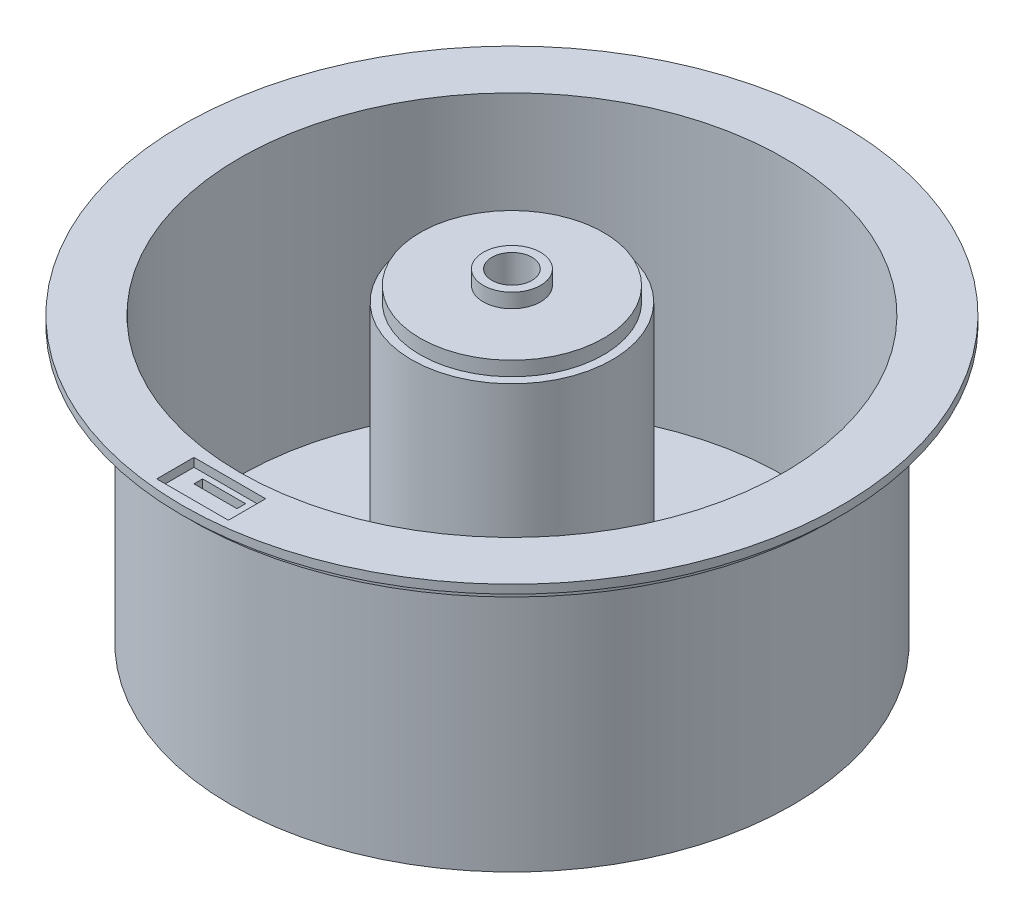
ISO-10303-21;
HEADER;
FILE_DESCRIPTION(('STEP AP214'),'2;1');
FILE_NAME('part.step','',(''),(''),'','','');
FILE_SCHEMA(('AUTOMOTIVE_DESIGN { 1 0 10303 214 1 1 1 1 }'));
ENDSEC;
DATA;
#1=APPLICATION_CONTEXT('core data for automotive mechanical design processes');
#2=APPLICATION_PROTOCOL_DEFINITION('international standard','automotive_design',2000,#1);
#3=PRODUCT_CONTEXT('',#1,'mechanical');
#4=PRODUCT('Part','Part','',(#3));
#5=PRODUCT_RELATED_PRODUCT_CATEGORY('part','',(#4));
#6=PRODUCT_DEFINITION_FORMATION('','',#4);
#7=PRODUCT_DEFINITION_CONTEXT('part definition',#1,'design');
#8=PRODUCT_DEFINITION('design','',#6,#7);
#9=PRODUCT_DEFINITION_SHAPE('','',#8);
#10=(LENGTH_UNIT() NAMED_UNIT(*) SI_UNIT(.MILLI.,.METRE.));
#11=(NAMED_UNIT(*) PLANE_ANGLE_UNIT() SI_UNIT($,.RADIAN.));
#12=(NAMED_UNIT(*) SI_UNIT($,.STERADIAN.) SOLID_ANGLE_UNIT());
#13=UNCERTAINTY_MEASURE_WITH_UNIT(LENGTH_MEASURE(1.E-05),#10,'distance_accuracy_value','');
#14=(GEOMETRIC_REPRESENTATION_CONTEXT(3) GLOBAL_UNCERTAINTY_ASSIGNED_CONTEXT((#13)) GLOBAL_UNIT_ASSIGNED_CONTEXT((#10,
#11,#12)) REPRESENTATION_CONTEXT('',''));
#15=CARTESIAN_POINT('',(0.,0.,0.));
#16=DIRECTION('',(0.,0.,1.));
#17=DIRECTION('',(1.,0.,0.));
#18=AXIS2_PLACEMENT_3D('',#15,#16,#17);
#19=CARTESIAN_POINT('',(0.,3.,0.));
#20=DIRECTION('',(0.,-1.,0.));
#21=DIRECTION('',(0.,0.,-1.));
#22=AXIS2_PLACEMENT_3D('',#19,#20,#21);
#23=CYLINDRICAL_SURFACE('',#22,115.);
#24=CARTESIAN_POINT('',(0.,3.,0.));
#25=DIRECTION('',(0.,1.,0.));
#26=DIRECTION('',(0.,0.,1.));
#27=AXIS2_PLACEMENT_3D('',#24,#25,#26);
#28=CIRCLE('',#27,115.);
#29=CARTESIAN_POINT('',(0.,3.,115.));
#30=VERTEX_POINT('',#29);
#31=EDGE_CURVE('E236',#30,#30,#28,.T.);
#32=ORIENTED_EDGE('',*,*,#31,.F.);
#33=EDGE_LOOP('',(#32));
#34=FACE_BOUND('',#33,.T.);
#35=CARTESIAN_POINT('',(0.,0.,0.));
#36=DIRECTION('',(0.,1.,0.));
#37=DIRECTION('',(0.,0.,1.));
#38=AXIS2_PLACEMENT_3D('',#35,#36,#37);
#39=CIRCLE('',#38,115.);
#40=CARTESIAN_POINT('',(0.,0.,115.));
#41=VERTEX_POINT('',#40);
#42=EDGE_CURVE('E231',#41,#41,#39,.T.);
#43=ORIENTED_EDGE('',*,*,#42,.T.);
#44=EDGE_LOOP('',(#43));
#45=FACE_BOUND('',#44,.T.);
#46=ADVANCED_FACE('F37',(#34,#45),#23,.T.);
#47=CARTESIAN_POINT('',(0.,3.,0.));
#48=DIRECTION('',(0.,1.,0.));
#49=DIRECTION('',(0.,0.,1.));
#50=AXIS2_PLACEMENT_3D('',#47,#48,#49);
#51=PLANE('',#50);
#52=DIRECTION('',(0.,0.,-1.));
#53=VECTOR('',#52,1.);
#54=CARTESIAN_POINT('',(12.5,3.,0.));
#55=LINE('',#54,#53);
#56=CARTESIAN_POINT('',(12.5,3.,111.450332640408));
#57=VERTEX_POINT('',#56);
#58=CARTESIAN_POINT('',(12.5,3.,98.4503326404081));
#59=VERTEX_POINT('',#58);
#60=EDGE_CURVE('E177',#57,#59,#55,.T.);
#61=ORIENTED_EDGE('',*,*,#60,.F.);
#62=DIRECTION('',(1.,0.,0.));
#63=VECTOR('',#62,1.);
#64=CARTESIAN_POINT('',(0.,3.,111.450332640408));
#65=LINE('',#64,#63);
#66=CARTESIAN_POINT('',(-12.5,3.,111.450332640408));
#67=VERTEX_POINT('',#66);
#68=EDGE_CURVE('E175',#67,#57,#65,.T.);
#69=ORIENTED_EDGE('',*,*,#68,.F.);
#70=DIRECTION('',(0.,0.,1.));
#71=VECTOR('',#70,1.);
#72=CARTESIAN_POINT('',(-12.5,3.,0.));
#73=LINE('',#72,#71);
#74=CARTESIAN_POINT('',(-12.5,3.,98.4503326404081));
#75=VERTEX_POINT('',#74);
#76=EDGE_CURVE('E166',#75,#67,#73,.T.);
#77=ORIENTED_EDGE('',*,*,#76,.F.);
#78=DIRECTION('',(-1.,0.,0.));
#79=VECTOR('',#78,1.);
#80=CARTESIAN_POINT('',(0.,3.,98.4503326404081));
#81=LINE('',#80,#79);
#82=EDGE_CURVE('E11',#59,#75,#81,.T.);
#83=ORIENTED_EDGE('',*,*,#82,.F.);
#84=EDGE_LOOP('',(#61,#69,#77,#83));
#85=FACE_BOUND('',#84,.T.);
#86=CARTESIAN_POINT('',(0.,3.,0.));
#87=DIRECTION('',(0.,1.,0.));
#88=DIRECTION('',(0.,0.,1.));
#89=AXIS2_PLACEMENT_3D('',#86,#87,#88);
#90=CIRCLE('',#89,95.);
#91=CARTESIAN_POINT('',(0.,3.,95.));
#92=VERTEX_POINT('',#91);
#93=EDGE_CURVE('E214',#92,#92,#90,.T.);
#94=ORIENTED_EDGE('',*,*,#93,.F.);
#95=EDGE_LOOP('',(#94));
#96=FACE_BOUND('',#95,.T.);
#97=ORIENTED_EDGE('',*,*,#31,.T.);
#98=EDGE_LOOP('',(#97));
#99=FACE_BOUND('',#98,.T.);
#100=ADVANCED_FACE('F245',(#85,#96,#99),#51,.T.);
#101=CARTESIAN_POINT('',(0.,0.,0.));
#102=DIRECTION('',(0.,1.,0.));
#103=DIRECTION('',(0.,0.,1.));
#104=AXIS2_PLACEMENT_3D('',#101,#102,#103);
#105=PLANE('',#104);
#106=DIRECTION('',(1.,0.,0.));
#107=VECTOR('',#106,1.);
#108=CARTESIAN_POINT('',(-12.5,0.,111.450332640408));
#109=LINE('',#108,#107);
#110=CARTESIAN_POINT('',(11.0825698437851,0.,111.450332640408));
#111=VERTEX_POINT('',#110);
#112=CARTESIAN_POINT('',(12.5,0.,111.450332640408));
#113=VERTEX_POINT('',#112);
#114=EDGE_CURVE('E157',#111,#113,#109,.T.);
#115=ORIENTED_EDGE('',*,*,#114,.T.);
#116=DIRECTION('',(0.,0.,-1.));
#117=VECTOR('',#116,1.);
#118=CARTESIAN_POINT('',(12.5,0.,98.4503326404081));
#119=LINE('',#118,#117);
#120=CARTESIAN_POINT('',(12.5,0.,111.300269541453));
#121=VERTEX_POINT('',#120);
#122=EDGE_CURVE('E148',#113,#121,#119,.T.);
#123=ORIENTED_EDGE('',*,*,#122,.T.);
#124=CARTESIAN_POINT('',(0.,0.,0.));
#125=DIRECTION('',(0.,-1.,0.));
#126=DIRECTION('',(0.,0.,-1.));
#127=AXIS2_PLACEMENT_3D('',#124,#125,#126);
#128=CIRCLE('',#127,112.);
#129=CARTESIAN_POINT('',(-12.5,0.,111.300269541453));
#130=VERTEX_POINT('',#129);
#131=EDGE_CURVE('E235',#130,#121,#128,.T.);
#132=ORIENTED_EDGE('',*,*,#131,.F.);
#133=DIRECTION('',(0.,0.,1.));
#134=VECTOR('',#133,1.);
#135=CARTESIAN_POINT('',(-12.5,0.,98.4503326404081));
#136=LINE('',#135,#134);
#137=CARTESIAN_POINT('',(-12.5,0.,111.450332640408));
#138=VERTEX_POINT('',#137);
#139=EDGE_CURVE('E154',#130,#138,#136,.T.);
#140=ORIENTED_EDGE('',*,*,#139,.T.);
#141=CARTESIAN_POINT('',(-11.0825698437851,0.,111.450332640408));
#142=VERTEX_POINT('',#141);
#143=EDGE_CURVE('E158',#138,#142,#109,.T.);
#144=ORIENTED_EDGE('',*,*,#143,.T.);
#145=EDGE_CURVE('E234',#111,#142,#128,.T.);
#146=ORIENTED_EDGE('',*,*,#145,.F.);
#147=EDGE_LOOP('',(#115,#123,#132,#140,#144,#146));
#148=FACE_BOUND('',#147,.T.);
#149=ORIENTED_EDGE('',*,*,#42,.F.);
#150=EDGE_LOOP('',(#149));
#151=FACE_BOUND('',#150,.T.);
#152=ADVANCED_FACE('F242',(#148,#151),#105,.F.);
#153=CARTESIAN_POINT('',(0.,-3.,0.));
#154=DIRECTION('',(0.,1.,0.));
#155=DIRECTION('',(0.,0.,1.));
#156=AXIS2_PLACEMENT_3D('',#153,#154,#155);
#157=CYLINDRICAL_SURFACE('',#156,112.);
#158=CARTESIAN_POINT('',(0.,-3.,0.));
#159=DIRECTION('',(0.,-1.,0.));
#160=DIRECTION('',(0.,0.,-1.));
#161=AXIS2_PLACEMENT_3D('',#158,#159,#160);
#162=CIRCLE('',#161,112.);
#163=CARTESIAN_POINT('',(0.,-3.,-112.));
#164=VERTEX_POINT('',#163);
#165=EDGE_CURVE('E225',#164,#164,#162,.T.);
#166=ORIENTED_EDGE('',*,*,#165,.F.);
#167=EDGE_LOOP('',(#166));
#168=FACE_BOUND('',#167,.T.);
#169=EDGE_CURVE('E228',#121,#111,#128,.T.);
#170=ORIENTED_EDGE('',*,*,#169,.T.);
#171=ORIENTED_EDGE('',*,*,#145,.T.);
#172=EDGE_CURVE('E610',#142,#130,#128,.T.);
#173=ORIENTED_EDGE('',*,*,#172,.T.);
#174=ORIENTED_EDGE('',*,*,#131,.T.);
#175=EDGE_LOOP('',(#170,#171,#173,#174));
#176=FACE_BOUND('',#175,.T.);
#177=ADVANCED_FACE('F244',(#168,#176),#157,.T.);
#178=CARTESIAN_POINT('',(0.,-3.,0.));
#179=DIRECTION('',(0.,-1.,0.));
#180=DIRECTION('',(0.,0.,-1.));
#181=AXIS2_PLACEMENT_3D('',#178,#179,#180);
#182=PLANE('',#181);
#183=DIRECTION('',(0.,0.,1.));
#184=VECTOR('',#183,1.);
#185=CARTESIAN_POINT('',(7.5,-3.,0.));
#186=LINE('',#185,#184);
#187=CARTESIAN_POINT('',(7.50000000000002,-3.,100.450332640408));
#188=VERTEX_POINT('',#187);
#189=CARTESIAN_POINT('',(7.50000000000003,-3.,103.450332640408));
#190=VERTEX_POINT('',#189);
#191=EDGE_CURVE('E145',#188,#190,#186,.T.);
#192=ORIENTED_EDGE('',*,*,#191,.F.);
#193=DIRECTION('',(1.,0.,0.));
#194=VECTOR('',#193,1.);
#195=CARTESIAN_POINT('',(0.,-3.,100.450332640408));
#196=LINE('',#195,#194);
#197=CARTESIAN_POINT('',(-7.49999999999997,-3.,100.450332640408));
#198=VERTEX_POINT('',#197);
#199=EDGE_CURVE('E138',#198,#188,#196,.T.);
#200=ORIENTED_EDGE('',*,*,#199,.F.);
#201=DIRECTION('',(0.,0.,-1.));
#202=VECTOR('',#201,1.);
#203=CARTESIAN_POINT('',(-7.5,-3.,0.));
#204=LINE('',#203,#202);
#205=CARTESIAN_POINT('',(-7.49999999999997,-3.,103.450332640408));
#206=VERTEX_POINT('',#205);
#207=EDGE_CURVE('E118',#206,#198,#204,.T.);
#208=ORIENTED_EDGE('',*,*,#207,.F.);
#209=DIRECTION('',(-1.,0.,0.));
#210=VECTOR('',#209,1.);
#211=CARTESIAN_POINT('',(0.,-3.,103.450332640408));
#212=LINE('',#211,#210);
#213=EDGE_CURVE('E143',#190,#206,#212,.T.);
#214=ORIENTED_EDGE('',*,*,#213,.F.);
#215=EDGE_LOOP('',(#192,#200,#208,#214));
#216=FACE_BOUND('',#215,.T.);
#217=CARTESIAN_POINT('',(0.,-3.,0.));
#218=DIRECTION('',(0.,-1.,0.));
#219=DIRECTION('',(0.,0.,-1.));
#220=AXIS2_PLACEMENT_3D('',#217,#218,#219);
#221=CIRCLE('',#220,98.);
#222=CARTESIAN_POINT('',(0.,-3.,-98.));
#223=VERTEX_POINT('',#222);
#224=EDGE_CURVE('E210',#223,#223,#221,.T.);
#225=ORIENTED_EDGE('',*,*,#224,.F.);
#226=EDGE_LOOP('',(#225));
#227=FACE_BOUND('',#226,.T.);
#228=ORIENTED_EDGE('',*,*,#165,.T.);
#229=EDGE_LOOP('',(#228));
#230=FACE_BOUND('',#229,.T.);
#231=ADVANCED_FACE('F251',(#216,#227,#230),#182,.T.);
#232=CARTESIAN_POINT('',(0.,-96.,0.));
#233=DIRECTION('',(0.,1.,0.));
#234=DIRECTION('',(0.,0.,1.));
#235=AXIS2_PLACEMENT_3D('',#232,#233,#234);
#236=CYLINDRICAL_SURFACE('',#235,98.);
#237=CARTESIAN_POINT('',(0.,-96.,0.));
#238=DIRECTION('',(0.,-1.,0.));
#239=DIRECTION('',(0.,0.,-1.));
#240=AXIS2_PLACEMENT_3D('',#237,#238,#239);
#241=CIRCLE('',#240,98.);
#242=CARTESIAN_POINT('',(0.,-96.,-98.));
#243=VERTEX_POINT('',#242);
#244=EDGE_CURVE('E220',#243,#243,#241,.T.);
#245=ORIENTED_EDGE('',*,*,#244,.F.);
#246=EDGE_LOOP('',(#245));
#247=FACE_BOUND('',#246,.T.);
#248=ORIENTED_EDGE('',*,*,#224,.T.);
#249=EDGE_LOOP('',(#248));
#250=FACE_BOUND('',#249,.T.);
#251=ADVANCED_FACE('F345',(#247,#250),#236,.T.);
#252=CARTESIAN_POINT('',(0.,-96.,0.));
#253=DIRECTION('',(0.,-1.,0.));
#254=DIRECTION('',(0.,0.,-1.));
#255=AXIS2_PLACEMENT_3D('',#252,#253,#254);
#256=PLANE('',#255);
#257=CARTESIAN_POINT('',(0.,-96.,0.));
#258=DIRECTION('',(0.,-1.,0.));
#259=DIRECTION('',(0.,0.,-1.));
#260=AXIS2_PLACEMENT_3D('',#257,#258,#259);
#261=CIRCLE('',#260,32.);
#262=CARTESIAN_POINT('',(0.,-96.,-32.));
#263=VERTEX_POINT('',#262);
#264=EDGE_CURVE('E196',#263,#263,#261,.T.);
#265=ORIENTED_EDGE('',*,*,#264,.F.);
#266=EDGE_LOOP('',(#265));
#267=FACE_BOUND('',#266,.T.);
#268=ORIENTED_EDGE('',*,*,#244,.T.);
#269=EDGE_LOOP('',(#268));
#270=FACE_BOUND('',#269,.T.);
#271=ADVANCED_FACE('F526',(#267,#270),#256,.T.);
#272=CARTESIAN_POINT('',(0.,-93.,0.));
#273=DIRECTION('',(0.,1.,0.));
#274=DIRECTION('',(0.,0.,1.));
#275=AXIS2_PLACEMENT_3D('',#272,#273,#274);
#276=CYLINDRICAL_SURFACE('',#275,95.);
#277=CARTESIAN_POINT('',(0.,-93.,0.));
#278=DIRECTION('',(0.,1.,0.));
#279=DIRECTION('',(0.,0.,1.));
#280=AXIS2_PLACEMENT_3D('',#277,#278,#279);
#281=CIRCLE('',#280,95.);
#282=CARTESIAN_POINT('',(0.,-93.,95.));
#283=VERTEX_POINT('',#282);
#284=EDGE_CURVE('E217',#283,#283,#281,.T.);
#285=ORIENTED_EDGE('',*,*,#284,.F.);
#286=EDGE_LOOP('',(#285));
#287=FACE_BOUND('',#286,.T.);
#288=ORIENTED_EDGE('',*,*,#93,.T.);
#289=EDGE_LOOP('',(#288));
#290=FACE_BOUND('',#289,.T.);
#291=ADVANCED_FACE('F516',(#287,#290),#276,.F.);
#292=CARTESIAN_POINT('',(0.,-93.,0.));
#293=DIRECTION('',(0.,1.,0.));
#294=DIRECTION('',(0.,0.,1.));
#295=AXIS2_PLACEMENT_3D('',#292,#293,#294);
#296=PLANE('',#295);
#297=CARTESIAN_POINT('',(0.,-93.,0.));
#298=DIRECTION('',(0.,1.,0.));
#299=DIRECTION('',(0.,0.,1.));
#300=AXIS2_PLACEMENT_3D('',#297,#298,#299);
#301=CIRCLE('',#300,35.);
#302=CARTESIAN_POINT('',(0.,-93.,35.));
#303=VERTEX_POINT('',#302);
#304=EDGE_CURVE('E207',#303,#303,#301,.T.);
#305=ORIENTED_EDGE('',*,*,#304,.F.);
#306=EDGE_LOOP('',(#305));
#307=FACE_BOUND('',#306,.T.);
#308=ORIENTED_EDGE('',*,*,#284,.T.);
#309=EDGE_LOOP('',(#308));
#310=FACE_BOUND('',#309,.T.);
#311=ADVANCED_FACE('F506',(#307,#310),#296,.T.);
#312=CARTESIAN_POINT('',(0.,7.00000000000001,0.));
#313=DIRECTION('',(0.,-1.,0.));
#314=DIRECTION('',(0.,0.,-1.));
#315=AXIS2_PLACEMENT_3D('',#312,#313,#314);
#316=CYLINDRICAL_SURFACE('',#315,35.);
#317=CARTESIAN_POINT('',(0.,7.00000000000001,0.));
#318=DIRECTION('',(0.,1.,0.));
#319=DIRECTION('',(0.,0.,1.));
#320=AXIS2_PLACEMENT_3D('',#317,#318,#319);
#321=CIRCLE('',#320,35.);
#322=CARTESIAN_POINT('',(0.,7.00000000000001,35.));
#323=VERTEX_POINT('',#322);
#324=EDGE_CURVE('E211',#323,#323,#321,.T.);
#325=ORIENTED_EDGE('',*,*,#324,.F.);
#326=EDGE_LOOP('',(#325));
#327=FACE_BOUND('',#326,.T.);
#328=ORIENTED_EDGE('',*,*,#304,.T.);
#329=EDGE_LOOP('',(#328));
#330=FACE_BOUND('',#329,.T.);
#331=ADVANCED_FACE('F496',(#327,#330),#316,.T.);
#332=CARTESIAN_POINT('',(0.,7.00000000000001,0.));
#333=DIRECTION('',(0.,1.,0.));
#334=DIRECTION('',(0.,0.,1.));
#335=AXIS2_PLACEMENT_3D('',#332,#333,#334);
#336=PLANE('',#335);
#337=CARTESIAN_POINT('',(0.,7.00000000000001,0.));
#338=DIRECTION('',(0.,1.,0.));
#339=DIRECTION('',(0.,0.,1.));
#340=AXIS2_PLACEMENT_3D('',#337,#338,#339);
#341=CIRCLE('',#340,32.);
#342=CARTESIAN_POINT('',(0.,7.00000000000001,32.));
#343=VERTEX_POINT('',#342);
#344=EDGE_CURVE('E192',#343,#343,#341,.T.);
#345=ORIENTED_EDGE('',*,*,#344,.F.);
#346=EDGE_LOOP('',(#345));
#347=FACE_BOUND('',#346,.T.);
#348=ORIENTED_EDGE('',*,*,#324,.T.);
#349=EDGE_LOOP('',(#348));
#350=FACE_BOUND('',#349,.T.);
#351=ADVANCED_FACE('F486',(#347,#350),#336,.T.);
#352=CARTESIAN_POINT('',(0.,12.,0.));
#353=DIRECTION('',(0.,-1.,0.));
#354=DIRECTION('',(0.,0.,-1.));
#355=AXIS2_PLACEMENT_3D('',#352,#353,#354);
#356=CYLINDRICAL_SURFACE('',#355,32.);
#357=CARTESIAN_POINT('',(0.,12.,0.));
#358=DIRECTION('',(0.,1.,0.));
#359=DIRECTION('',(0.,0.,1.));
#360=AXIS2_PLACEMENT_3D('',#357,#358,#359);
#361=CIRCLE('',#360,32.);
#362=CARTESIAN_POINT('',(0.,12.,32.));
#363=VERTEX_POINT('',#362);
#364=EDGE_CURVE('E202',#363,#363,#361,.T.);
#365=ORIENTED_EDGE('',*,*,#364,.F.);
#366=EDGE_LOOP('',(#365));
#367=FACE_BOUND('',#366,.T.);
#368=ORIENTED_EDGE('',*,*,#344,.T.);
#369=EDGE_LOOP('',(#368));
#370=FACE_BOUND('',#369,.T.);
#371=ADVANCED_FACE('F476',(#367,#370),#356,.T.);
#372=CARTESIAN_POINT('',(0.,12.,0.));
#373=DIRECTION('',(0.,1.,0.));
#374=DIRECTION('',(0.,0.,1.));
#375=AXIS2_PLACEMENT_3D('',#372,#373,#374);
#376=PLANE('',#375);
#377=CARTESIAN_POINT('',(0.,12.,0.));
#378=DIRECTION('',(0.,1.,0.));
#379=DIRECTION('',(0.,0.,1.));
#380=AXIS2_PLACEMENT_3D('',#377,#378,#379);
#381=CIRCLE('',#380,10.);
#382=CARTESIAN_POINT('',(0.,12.,10.));
#383=VERTEX_POINT('',#382);
#384=EDGE_CURVE('E44',#383,#383,#381,.T.);
#385=ORIENTED_EDGE('',*,*,#384,.F.);
#386=EDGE_LOOP('',(#385));
#387=FACE_BOUND('',#386,.T.);
#388=ORIENTED_EDGE('',*,*,#364,.T.);
#389=EDGE_LOOP('',(#388));
#390=FACE_BOUND('',#389,.T.);
#391=ADVANCED_FACE('F466',(#387,#390),#376,.T.);
#392=CARTESIAN_POINT('',(0.,3.00000000000003,0.));
#393=DIRECTION('',(0.,-1.,0.));
#394=DIRECTION('',(0.,0.,-1.));
#395=AXIS2_PLACEMENT_3D('',#392,#393,#394);
#396=CYLINDRICAL_SURFACE('',#395,32.);
#397=CARTESIAN_POINT('',(0.,3.00000000000003,0.));
#398=DIRECTION('',(0.,-1.,0.));
#399=DIRECTION('',(0.,0.,-1.));
#400=AXIS2_PLACEMENT_3D('',#397,#398,#399);
#401=CIRCLE('',#400,32.);
#402=CARTESIAN_POINT('',(0.,3.00000000000003,-32.));
#403=VERTEX_POINT('',#402);
#404=EDGE_CURVE('E199',#403,#403,#401,.T.);
#405=ORIENTED_EDGE('',*,*,#404,.F.);
#406=EDGE_LOOP('',(#405));
#407=FACE_BOUND('',#406,.T.);
#408=ORIENTED_EDGE('',*,*,#264,.T.);
#409=EDGE_LOOP('',(#408));
#410=FACE_BOUND('',#409,.T.);
#411=ADVANCED_FACE('F456',(#407,#410),#396,.F.);
#412=CARTESIAN_POINT('',(0.,3.00000000000003,0.));
#413=DIRECTION('',(0.,-1.,0.));
#414=DIRECTION('',(0.,0.,-1.));
#415=AXIS2_PLACEMENT_3D('',#412,#413,#414);
#416=PLANE('',#415);
#417=CARTESIAN_POINT('',(0.,3.00000000000003,0.));
#418=DIRECTION('',(0.,-1.,0.));
#419=DIRECTION('',(0.,0.,-1.));
#420=AXIS2_PLACEMENT_3D('',#417,#418,#419);
#421=CIRCLE('',#420,28.);
#422=CARTESIAN_POINT('',(0.,3.00000000000003,-28.));
#423=VERTEX_POINT('',#422);
#424=EDGE_CURVE('E189',#423,#423,#421,.T.);
#425=ORIENTED_EDGE('',*,*,#424,.F.);
#426=EDGE_LOOP('',(#425));
#427=FACE_BOUND('',#426,.T.);
#428=ORIENTED_EDGE('',*,*,#404,.T.);
#429=EDGE_LOOP('',(#428));
#430=FACE_BOUND('',#429,.T.);
#431=ADVANCED_FACE('F446',(#427,#430),#416,.T.);
#432=CARTESIAN_POINT('',(0.,7.00000000000003,0.));
#433=DIRECTION('',(0.,-1.,0.));
#434=DIRECTION('',(0.,0.,-1.));
#435=AXIS2_PLACEMENT_3D('',#432,#433,#434);
#436=CYLINDRICAL_SURFACE('',#435,28.);
#437=CARTESIAN_POINT('',(0.,7.00000000000003,0.));
#438=DIRECTION('',(0.,-1.,0.));
#439=DIRECTION('',(0.,0.,-1.));
#440=AXIS2_PLACEMENT_3D('',#437,#438,#439);
#441=CIRCLE('',#440,28.);
#442=CARTESIAN_POINT('',(0.,7.00000000000003,-28.));
#443=VERTEX_POINT('',#442);
#444=EDGE_CURVE('E193',#443,#443,#441,.T.);
#445=ORIENTED_EDGE('',*,*,#444,.F.);
#446=EDGE_LOOP('',(#445));
#447=FACE_BOUND('',#446,.T.);
#448=ORIENTED_EDGE('',*,*,#424,.T.);
#449=EDGE_LOOP('',(#448));
#450=FACE_BOUND('',#449,.T.);
#451=ADVANCED_FACE('F436',(#447,#450),#436,.F.);
#452=CARTESIAN_POINT('',(0.,7.00000000000003,0.));
#453=DIRECTION('',(0.,-1.,0.));
#454=DIRECTION('',(0.,0.,-1.));
#455=AXIS2_PLACEMENT_3D('',#452,#453,#454);
#456=PLANE('',#455);
#457=CARTESIAN_POINT('',(0.,7.00000000000003,0.));
#458=DIRECTION('',(0.,-1.,0.));
#459=DIRECTION('',(0.,0.,-1.));
#460=AXIS2_PLACEMENT_3D('',#457,#458,#459);
#461=CIRCLE('',#460,7.);
#462=CARTESIAN_POINT('',(0.,7.00000000000003,-7.));
#463=VERTEX_POINT('',#462);
#464=EDGE_CURVE('E183',#463,#463,#461,.T.);
#465=ORIENTED_EDGE('',*,*,#464,.F.);
#466=EDGE_LOOP('',(#465));
#467=FACE_BOUND('',#466,.T.);
#468=ORIENTED_EDGE('',*,*,#444,.T.);
#469=EDGE_LOOP('',(#468));
#470=FACE_BOUND('',#469,.T.);
#471=ADVANCED_FACE('F426',(#467,#470),#456,.T.);
#472=CARTESIAN_POINT('',(0.,17.,0.));
#473=DIRECTION('',(0.,-1.,0.));
#474=DIRECTION('',(0.,0.,-1.));
#475=AXIS2_PLACEMENT_3D('',#472,#473,#474);
#476=CYLINDRICAL_SURFACE('',#475,10.);
#477=CARTESIAN_POINT('',(0.,17.,0.));
#478=DIRECTION('',(0.,1.,0.));
#479=DIRECTION('',(0.,0.,1.));
#480=AXIS2_PLACEMENT_3D('',#477,#478,#479);
#481=CIRCLE('',#480,10.);
#482=CARTESIAN_POINT('',(0.,17.,10.));
#483=VERTEX_POINT('',#482);
#484=EDGE_CURVE('E186',#483,#483,#481,.T.);
#485=ORIENTED_EDGE('',*,*,#484,.F.);
#486=EDGE_LOOP('',(#485));
#487=FACE_BOUND('',#486,.T.);
#488=ORIENTED_EDGE('',*,*,#384,.T.);
#489=EDGE_LOOP('',(#488));
#490=FACE_BOUND('',#489,.T.);
#491=ADVANCED_FACE('F417',(#487,#490),#476,.T.);
#492=CARTESIAN_POINT('',(0.,17.,0.));
#493=DIRECTION('',(0.,1.,0.));
#494=DIRECTION('',(0.,0.,1.));
#495=AXIS2_PLACEMENT_3D('',#492,#493,#494);
#496=PLANE('',#495);
#497=CARTESIAN_POINT('',(0.,17.,0.));
#498=DIRECTION('',(0.,1.,0.));
#499=DIRECTION('',(0.,0.,1.));
#500=AXIS2_PLACEMENT_3D('',#497,#498,#499);
#501=CIRCLE('',#500,7.);
#502=CARTESIAN_POINT('',(0.,17.,7.));
#503=VERTEX_POINT('',#502);
#504=EDGE_CURVE('E180',#503,#503,#501,.T.);
#505=ORIENTED_EDGE('',*,*,#504,.F.);
#506=EDGE_LOOP('',(#505));
#507=FACE_BOUND('',#506,.T.);
#508=ORIENTED_EDGE('',*,*,#484,.T.);
#509=EDGE_LOOP('',(#508));
#510=FACE_BOUND('',#509,.T.);
#511=ADVANCED_FACE('F408',(#507,#510),#496,.T.);
#512=CARTESIAN_POINT('',(0.,-18.,0.));
#513=DIRECTION('',(0.,1.,0.));
#514=DIRECTION('',(0.,0.,1.));
#515=AXIS2_PLACEMENT_3D('',#512,#513,#514);
#516=CYLINDRICAL_SURFACE('',#515,7.);
#517=ORIENTED_EDGE('',*,*,#464,.T.);
#518=EDGE_LOOP('',(#517));
#519=FACE_BOUND('',#518,.T.);
#520=ORIENTED_EDGE('',*,*,#504,.T.);
#521=EDGE_LOOP('',(#520));
#522=FACE_BOUND('',#521,.T.);
#523=ADVANCED_FACE('F275',(#519,#522),#516,.F.);
#524=CARTESIAN_POINT('',(0.,0.,0.));
#525=DIRECTION('',(0.,1.,0.));
#526=DIRECTION('',(0.,0.,1.));
#527=AXIS2_PLACEMENT_3D('',#524,#525,#526);
#528=PLANE('',#527);
#529=DIRECTION('',(0.,0.,-1.));
#530=VECTOR('',#529,1.);
#531=CARTESIAN_POINT('',(7.50000000000002,0.,100.450332640408));
#532=LINE('',#531,#530);
#533=CARTESIAN_POINT('',(7.50000000000003,0.,103.450332640408));
#534=VERTEX_POINT('',#533);
#535=CARTESIAN_POINT('',(7.50000000000002,0.,100.450332640408));
#536=VERTEX_POINT('',#535);
#537=EDGE_CURVE('E59',#534,#536,#532,.T.);
#538=ORIENTED_EDGE('',*,*,#537,.F.);
#539=DIRECTION('',(1.,0.,0.));
#540=VECTOR('',#539,1.);
#541=CARTESIAN_POINT('',(-7.49999999999997,0.,103.450332640408));
#542=LINE('',#541,#540);
#543=CARTESIAN_POINT('',(-7.49999999999997,0.,103.450332640408));
#544=VERTEX_POINT('',#543);
#545=EDGE_CURVE('E131',#544,#534,#542,.T.);
#546=ORIENTED_EDGE('',*,*,#545,.F.);
#547=DIRECTION('',(0.,0.,1.));
#548=VECTOR('',#547,1.);
#549=CARTESIAN_POINT('',(-7.49999999999997,0.,100.450332640408));
#550=LINE('',#549,#548);
#551=CARTESIAN_POINT('',(-7.49999999999997,0.,100.450332640408));
#552=VERTEX_POINT('',#551);
#553=EDGE_CURVE('E115',#552,#544,#550,.T.);
#554=ORIENTED_EDGE('',*,*,#553,.F.);
#555=DIRECTION('',(-1.,0.,0.));
#556=VECTOR('',#555,1.);
#557=CARTESIAN_POINT('',(-7.49999999999997,0.,100.450332640408));
#558=LINE('',#557,#556);
#559=EDGE_CURVE('E124',#536,#552,#558,.T.);
#560=ORIENTED_EDGE('',*,*,#559,.F.);
#561=EDGE_LOOP('',(#538,#546,#554,#560));
#562=FACE_BOUND('',#561,.T.);
#563=ORIENTED_EDGE('',*,*,#169,.F.);
#564=CARTESIAN_POINT('',(12.5,0.,98.4503326404081));
#565=VERTEX_POINT('',#564);
#566=EDGE_CURVE('E147',#121,#565,#119,.T.);
#567=ORIENTED_EDGE('',*,*,#566,.T.);
#568=DIRECTION('',(-1.,0.,0.));
#569=VECTOR('',#568,1.);
#570=CARTESIAN_POINT('',(-12.5,0.,98.4503326404081));
#571=LINE('',#570,#569);
#572=CARTESIAN_POINT('',(-12.5,0.,98.4503326404081));
#573=VERTEX_POINT('',#572);
#574=EDGE_CURVE('E151',#565,#573,#571,.T.);
#575=ORIENTED_EDGE('',*,*,#574,.T.);
#576=EDGE_CURVE('E155',#573,#130,#136,.T.);
#577=ORIENTED_EDGE('',*,*,#576,.T.);
#578=ORIENTED_EDGE('',*,*,#172,.F.);
#579=EDGE_CURVE('E162',#142,#111,#109,.T.);
#580=ORIENTED_EDGE('',*,*,#579,.T.);
#581=EDGE_LOOP('',(#563,#567,#575,#577,#578,#580));
#582=FACE_BOUND('',#581,.T.);
#583=ADVANCED_FACE('F128',(#562,#582),#528,.T.);
#584=CARTESIAN_POINT('',(12.5,0.,98.4503326404081));
#585=DIRECTION('',(1.,0.,0.));
#586=DIRECTION('',(0.,0.,-1.));
#587=AXIS2_PLACEMENT_3D('',#584,#585,#586);
#588=PLANE('',#587);
#589=ORIENTED_EDGE('',*,*,#60,.T.);
#590=DIRECTION('',(0.,1.,0.));
#591=VECTOR('',#590,1.);
#592=CARTESIAN_POINT('',(12.5,0.,98.4503326404081));
#593=LINE('',#592,#591);
#594=EDGE_CURVE('E161',#565,#59,#593,.T.);
#595=ORIENTED_EDGE('',*,*,#594,.F.);
#596=ORIENTED_EDGE('',*,*,#566,.F.);
#597=ORIENTED_EDGE('',*,*,#122,.F.);
#598=DIRECTION('',(0.,1.,0.));
#599=VECTOR('',#598,1.);
#600=CARTESIAN_POINT('',(12.5,0.,111.450332640408));
#601=LINE('',#600,#599);
#602=EDGE_CURVE('E163',#113,#57,#601,.T.);
#603=ORIENTED_EDGE('',*,*,#602,.T.);
#604=EDGE_LOOP('',(#589,#595,#596,#597,#603));
#605=FACE_BOUND('',#604,.T.);
#606=ADVANCED_FACE('F294',(#605),#588,.F.);
#607=CARTESIAN_POINT('',(-12.5,0.,111.450332640408));
#608=DIRECTION('',(0.,0.,1.));
#609=DIRECTION('',(1.,0.,0.));
#610=AXIS2_PLACEMENT_3D('',#607,#608,#609);
#611=PLANE('',#610);
#612=ORIENTED_EDGE('',*,*,#68,.T.);
#613=ORIENTED_EDGE('',*,*,#602,.F.);
#614=ORIENTED_EDGE('',*,*,#114,.F.);
#615=ORIENTED_EDGE('',*,*,#579,.F.);
#616=ORIENTED_EDGE('',*,*,#143,.F.);
#617=DIRECTION('',(0.,1.,0.));
#618=VECTOR('',#617,1.);
#619=CARTESIAN_POINT('',(-12.5,0.,111.450332640408));
#620=LINE('',#619,#618);
#621=EDGE_CURVE('E167',#138,#67,#620,.T.);
#622=ORIENTED_EDGE('',*,*,#621,.T.);
#623=EDGE_LOOP('',(#612,#613,#614,#615,#616,#622));
#624=FACE_BOUND('',#623,.T.);
#625=ADVANCED_FACE('F299',(#624),#611,.F.);
#626=CARTESIAN_POINT('',(-12.5,0.,98.4503326404081));
#627=DIRECTION('',(-1.,0.,0.));
#628=DIRECTION('',(0.,0.,1.));
#629=AXIS2_PLACEMENT_3D('',#626,#627,#628);
#630=PLANE('',#629);
#631=ORIENTED_EDGE('',*,*,#76,.T.);
#632=ORIENTED_EDGE('',*,*,#621,.F.);
#633=ORIENTED_EDGE('',*,*,#139,.F.);
#634=ORIENTED_EDGE('',*,*,#576,.F.);
#635=DIRECTION('',(0.,1.,0.));
#636=VECTOR('',#635,1.);
#637=CARTESIAN_POINT('',(-12.5,0.,98.4503326404081));
#638=LINE('',#637,#636);
#639=EDGE_CURVE('E170',#573,#75,#638,.T.);
#640=ORIENTED_EDGE('',*,*,#639,.T.);
#641=EDGE_LOOP('',(#631,#632,#633,#634,#640));
#642=FACE_BOUND('',#641,.T.);
#643=ADVANCED_FACE('F312',(#642),#630,.F.);
#644=CARTESIAN_POINT('',(-12.5,0.,98.4503326404081));
#645=DIRECTION('',(0.,0.,-1.));
#646=DIRECTION('',(-1.,0.,0.));
#647=AXIS2_PLACEMENT_3D('',#644,#645,#646);
#648=PLANE('',#647);
#649=ORIENTED_EDGE('',*,*,#82,.T.);
#650=ORIENTED_EDGE('',*,*,#639,.F.);
#651=ORIENTED_EDGE('',*,*,#574,.F.);
#652=ORIENTED_EDGE('',*,*,#594,.T.);
#653=EDGE_LOOP('',(#649,#650,#651,#652));
#654=FACE_BOUND('',#653,.T.);
#655=ADVANCED_FACE('F323',(#654),#648,.F.);
#656=CARTESIAN_POINT('',(7.50000000000002,-10.,100.450332640408));
#657=DIRECTION('',(1.,0.,0.));
#658=DIRECTION('',(0.,0.,-1.));
#659=AXIS2_PLACEMENT_3D('',#656,#657,#658);
#660=PLANE('',#659);
#661=ORIENTED_EDGE('',*,*,#191,.T.);
#662=DIRECTION('',(0.,1.,0.));
#663=VECTOR('',#662,1.);
#664=CARTESIAN_POINT('',(7.50000000000003,-10.,103.450332640408));
#665=LINE('',#664,#663);
#666=EDGE_CURVE('E136',#190,#534,#665,.T.);
#667=ORIENTED_EDGE('',*,*,#666,.T.);
#668=ORIENTED_EDGE('',*,*,#537,.T.);
#669=DIRECTION('',(0.,1.,0.));
#670=VECTOR('',#669,1.);
#671=CARTESIAN_POINT('',(7.50000000000002,-10.,100.450332640408));
#672=LINE('',#671,#670);
#673=EDGE_CURVE('E121',#188,#536,#672,.T.);
#674=ORIENTED_EDGE('',*,*,#673,.F.);
#675=EDGE_LOOP('',(#661,#667,#668,#674));
#676=FACE_BOUND('',#675,.T.);
#677=ADVANCED_FACE('F334',(#676),#660,.F.);
#678=CARTESIAN_POINT('',(-7.49999999999997,-10.,103.450332640408));
#679=DIRECTION('',(0.,0.,1.));
#680=DIRECTION('',(1.,0.,0.));
#681=AXIS2_PLACEMENT_3D('',#678,#679,#680);
#682=PLANE('',#681);
#683=ORIENTED_EDGE('',*,*,#213,.T.);
#684=DIRECTION('',(0.,1.,0.));
#685=VECTOR('',#684,1.);
#686=CARTESIAN_POINT('',(-7.49999999999997,-10.,103.450332640408));
#687=LINE('',#686,#685);
#688=EDGE_CURVE('E120',#206,#544,#687,.T.);
#689=ORIENTED_EDGE('',*,*,#688,.T.);
#690=ORIENTED_EDGE('',*,*,#545,.T.);
#691=ORIENTED_EDGE('',*,*,#666,.F.);
#692=EDGE_LOOP('',(#683,#689,#690,#691));
#693=FACE_BOUND('',#692,.T.);
#694=ADVANCED_FACE('F363',(#693),#682,.F.);
#695=CARTESIAN_POINT('',(-7.49999999999997,-10.,100.450332640408));
#696=DIRECTION('',(-1.,0.,0.));
#697=DIRECTION('',(0.,0.,1.));
#698=AXIS2_PLACEMENT_3D('',#695,#696,#697);
#699=PLANE('',#698);
#700=ORIENTED_EDGE('',*,*,#207,.T.);
#701=DIRECTION('',(0.,1.,0.));
#702=VECTOR('',#701,1.);
#703=CARTESIAN_POINT('',(-7.49999999999997,-10.,100.450332640408));
#704=LINE('',#703,#702);
#705=EDGE_CURVE('E51',#198,#552,#704,.T.);
#706=ORIENTED_EDGE('',*,*,#705,.T.);
#707=ORIENTED_EDGE('',*,*,#553,.T.);
#708=ORIENTED_EDGE('',*,*,#688,.F.);
#709=EDGE_LOOP('',(#700,#706,#707,#708));
#710=FACE_BOUND('',#709,.T.);
#711=ADVANCED_FACE('F112',(#710),#699,.F.);
#712=CARTESIAN_POINT('',(-7.49999999999997,-10.,100.450332640408));
#713=DIRECTION('',(0.,0.,-1.));
#714=DIRECTION('',(-1.,0.,0.));
#715=AXIS2_PLACEMENT_3D('',#712,#713,#714);
#716=PLANE('',#715);
#717=ORIENTED_EDGE('',*,*,#199,.T.);
#718=ORIENTED_EDGE('',*,*,#673,.T.);
#719=ORIENTED_EDGE('',*,*,#559,.T.);
#720=ORIENTED_EDGE('',*,*,#705,.F.);
#721=EDGE_LOOP('',(#717,#718,#719,#720));
#722=FACE_BOUND('',#721,.T.);
#723=ADVANCED_FACE('F125',(#722),#716,.F.);
#724=CLOSED_SHELL('',(#46,#100,#152,#177,#231,#251,#271,#291,#311,#331,#351,#371,#391,#411,#431,
#451,#471,#491,#511,#523,#583,#606,#625,#643,#655,#677,#694,#711,#723));
#725=MANIFOLD_SOLID_BREP('B2',#724);
#726=ADVANCED_BREP_SHAPE_REPRESENTATION('',(#18,#725),#14);
#727=SHAPE_DEFINITION_REPRESENTATION(#9,#726);
ENDSEC;
END-ISO-10303-21;
